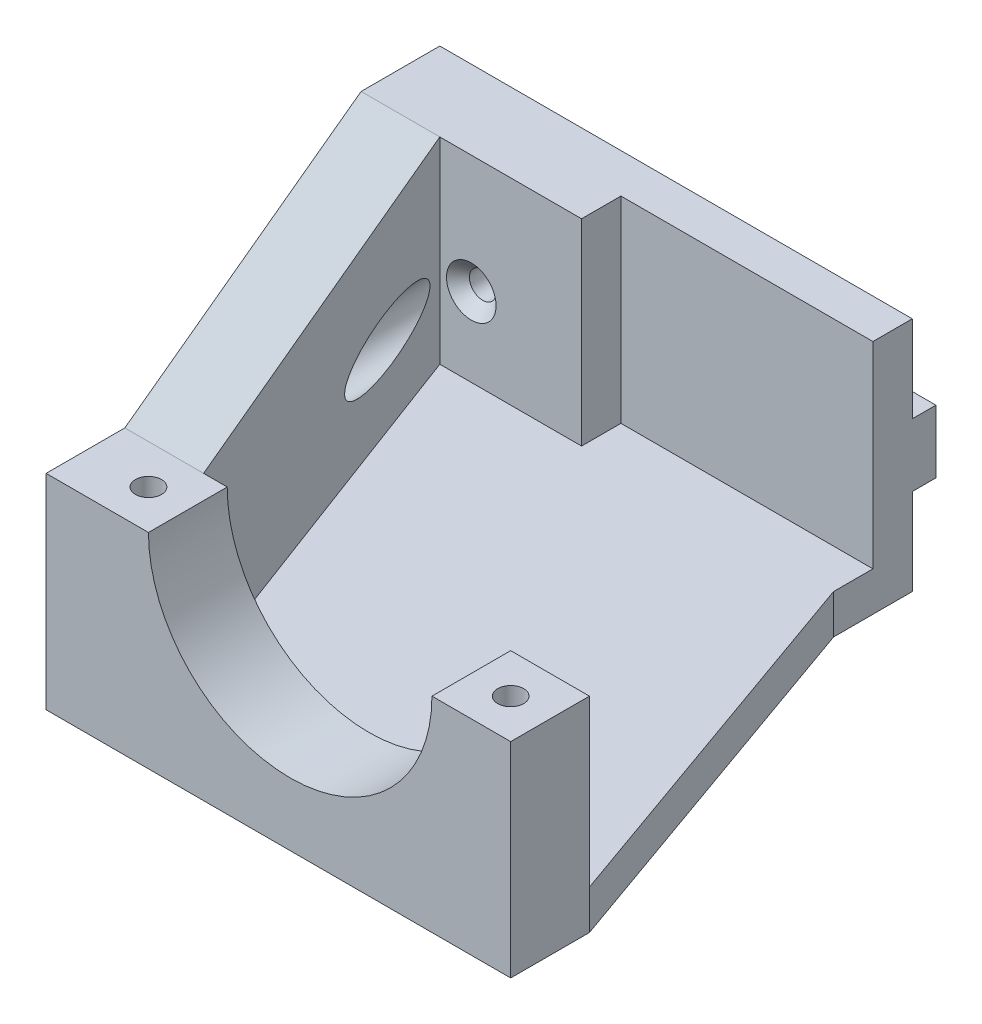
ISO-10303-21;
HEADER;
FILE_DESCRIPTION(('STEP AP214'),'2;1');
FILE_NAME('part.step','',(''),(''),'','','');
FILE_SCHEMA(('AUTOMOTIVE_DESIGN { 1 0 10303 214 1 1 1 1 }'));
ENDSEC;
DATA;
#1=APPLICATION_CONTEXT('core data for automotive mechanical design processes');
#2=APPLICATION_PROTOCOL_DEFINITION('international standard','automotive_design',2000,#1);
#3=PRODUCT_CONTEXT('',#1,'mechanical');
#4=PRODUCT('Part','Part','',(#3));
#5=PRODUCT_RELATED_PRODUCT_CATEGORY('part','',(#4));
#6=PRODUCT_DEFINITION_FORMATION('','',#4);
#7=PRODUCT_DEFINITION_CONTEXT('part definition',#1,'design');
#8=PRODUCT_DEFINITION('design','',#6,#7);
#9=PRODUCT_DEFINITION_SHAPE('','',#8);
#10=(LENGTH_UNIT() NAMED_UNIT(*) SI_UNIT(.MILLI.,.METRE.));
#11=(NAMED_UNIT(*) PLANE_ANGLE_UNIT() SI_UNIT($,.RADIAN.));
#12=(NAMED_UNIT(*) SI_UNIT($,.STERADIAN.) SOLID_ANGLE_UNIT());
#13=UNCERTAINTY_MEASURE_WITH_UNIT(LENGTH_MEASURE(1.E-05),#10,'distance_accuracy_value','');
#14=(GEOMETRIC_REPRESENTATION_CONTEXT(3) GLOBAL_UNCERTAINTY_ASSIGNED_CONTEXT((#13)) GLOBAL_UNIT_ASSIGNED_CONTEXT((#10,
#11,#12)) REPRESENTATION_CONTEXT('',''));
#15=CARTESIAN_POINT('',(0.,0.,0.));
#16=DIRECTION('',(0.,0.,1.));
#17=DIRECTION('',(1.,0.,0.));
#18=AXIS2_PLACEMENT_3D('',#15,#16,#17);
#19=CARTESIAN_POINT('',(18.,26.,68.));
#20=DIRECTION('',(0.,-1.,0.));
#21=DIRECTION('',(0.,0.,-1.));
#22=AXIS2_PLACEMENT_3D('',#19,#20,#21);
#23=PLANE('',#22);
#24=DIRECTION('',(-1.,0.,0.));
#25=VECTOR('',#24,1.);
#26=CARTESIAN_POINT('',(18.,26.,58.));
#27=LINE('',#26,#25);
#28=CARTESIAN_POINT('',(31.,26.,58.));
#29=VERTEX_POINT('',#28);
#30=CARTESIAN_POINT('',(28.,26.,58.));
#31=VERTEX_POINT('',#30);
#32=EDGE_CURVE('E303',#29,#31,#27,.T.);
#33=ORIENTED_EDGE('',*,*,#32,.T.);
#34=DIRECTION('',(1.,0.,0.));
#35=VECTOR('',#34,1.);
#36=CARTESIAN_POINT('',(18.,26.,58.));
#37=LINE('',#36,#35);
#38=CARTESIAN_POINT('',(18.,26.,58.));
#39=VERTEX_POINT('',#38);
#40=EDGE_CURVE('E338',#39,#31,#37,.T.);
#41=ORIENTED_EDGE('',*,*,#40,.F.);
#42=DIRECTION('',(0.,0.,-1.));
#43=VECTOR('',#42,1.);
#44=CARTESIAN_POINT('',(18.,26.,68.));
#45=LINE('',#44,#43);
#46=CARTESIAN_POINT('',(18.,26.,68.));
#47=VERTEX_POINT('',#46);
#48=EDGE_CURVE('E468',#47,#39,#45,.T.);
#49=ORIENTED_EDGE('',*,*,#48,.F.);
#50=DIRECTION('',(-1.,0.,0.));
#51=VECTOR('',#50,1.);
#52=CARTESIAN_POINT('',(18.,26.,68.));
#53=LINE('',#52,#51);
#54=CARTESIAN_POINT('',(31.,26.,68.));
#55=VERTEX_POINT('',#54);
#56=EDGE_CURVE('E309',#55,#47,#53,.T.);
#57=ORIENTED_EDGE('',*,*,#56,.F.);
#58=DIRECTION('',(0.,0.,-1.));
#59=VECTOR('',#58,1.);
#60=CARTESIAN_POINT('',(31.,26.,68.));
#61=LINE('',#60,#59);
#62=EDGE_CURVE('E476',#55,#29,#61,.T.);
#63=ORIENTED_EDGE('',*,*,#62,.T.);
#64=EDGE_LOOP('',(#33,#41,#49,#57,#63));
#65=FACE_BOUND('',#64,.T.);
#66=CARTESIAN_POINT('',(25.9999999999999,26.,63.));
#67=DIRECTION('',(0.,1.,0.));
#68=DIRECTION('',(0.,0.,1.));
#69=AXIS2_PLACEMENT_3D('',#66,#67,#68);
#70=CIRCLE('',#69,1.65);
#71=CARTESIAN_POINT('',(25.9999999999999,26.,64.65));
#72=VERTEX_POINT('',#71);
#73=EDGE_CURVE('E225',#72,#72,#70,.T.);
#74=ORIENTED_EDGE('',*,*,#73,.F.);
#75=EDGE_LOOP('',(#74));
#76=FACE_BOUND('',#75,.T.);
#77=ADVANCED_FACE('F52',(#65,#76),#23,.F.);
#78=CARTESIAN_POINT('',(0.,0.,0.));
#79=DIRECTION('',(0.,0.,-1.));
#80=DIRECTION('',(-1.,0.,0.));
#81=AXIS2_PLACEMENT_3D('',#78,#79,#80);
#82=PLANE('',#81);
#83=CARTESIAN_POINT('',(14.,15.,0.));
#84=DIRECTION('',(0.,0.,-1.));
#85=DIRECTION('',(-1.,0.,0.));
#86=AXIS2_PLACEMENT_3D('',#83,#84,#85);
#87=CIRCLE('',#86,1.7);
#88=CARTESIAN_POINT('',(12.3,15.,0.));
#89=VERTEX_POINT('',#88);
#90=EDGE_CURVE('E56',#89,#89,#87,.T.);
#91=ORIENTED_EDGE('',*,*,#90,.F.);
#92=EDGE_LOOP('',(#91));
#93=FACE_BOUND('',#92,.T.);
#94=DIRECTION('',(0.,-1.,0.));
#95=VECTOR('',#94,1.);
#96=CARTESIAN_POINT('',(5.,19.,0.));
#97=LINE('',#96,#95);
#98=CARTESIAN_POINT('',(5.,19.,0.));
#99=VERTEX_POINT('',#98);
#100=CARTESIAN_POINT('',(5.,11.,0.));
#101=VERTEX_POINT('',#100);
#102=EDGE_CURVE('E249',#99,#101,#97,.T.);
#103=ORIENTED_EDGE('',*,*,#102,.F.);
#104=DIRECTION('',(1.,0.,0.));
#105=VECTOR('',#104,1.);
#106=CARTESIAN_POINT('',(0.,19.,0.));
#107=LINE('',#106,#105);
#108=CARTESIAN_POINT('',(0.,19.,0.));
#109=VERTEX_POINT('',#108);
#110=EDGE_CURVE('E236',#109,#99,#107,.T.);
#111=ORIENTED_EDGE('',*,*,#110,.F.);
#112=DIRECTION('',(0.,-1.,0.));
#113=VECTOR('',#112,1.);
#114=CARTESIAN_POINT('',(0.,0.,0.));
#115=LINE('',#114,#113);
#116=CARTESIAN_POINT('',(0.,30.,0.));
#117=VERTEX_POINT('',#116);
#118=EDGE_CURVE('E591',#117,#109,#115,.T.);
#119=ORIENTED_EDGE('',*,*,#118,.F.);
#120=DIRECTION('',(-1.,0.,0.));
#121=VECTOR('',#120,1.);
#122=CARTESIAN_POINT('',(0.,30.,0.));
#123=LINE('',#122,#121);
#124=CARTESIAN_POINT('',(60.,30.,0.));
#125=VERTEX_POINT('',#124);
#126=EDGE_CURVE('E544',#125,#117,#123,.T.);
#127=ORIENTED_EDGE('',*,*,#126,.F.);
#128=DIRECTION('',(0.,1.,0.));
#129=VECTOR('',#128,1.);
#130=CARTESIAN_POINT('',(60.,0.,0.));
#131=LINE('',#130,#129);
#132=CARTESIAN_POINT('',(60.,19.,0.));
#133=VERTEX_POINT('',#132);
#134=EDGE_CURVE('E597',#133,#125,#131,.T.);
#135=ORIENTED_EDGE('',*,*,#134,.F.);
#136=DIRECTION('',(1.,0.,0.));
#137=VECTOR('',#136,1.);
#138=CARTESIAN_POINT('',(60.,19.,0.));
#139=LINE('',#138,#137);
#140=CARTESIAN_POINT('',(55.,19.,0.));
#141=VERTEX_POINT('',#140);
#142=EDGE_CURVE('E77',#141,#133,#139,.T.);
#143=ORIENTED_EDGE('',*,*,#142,.F.);
#144=DIRECTION('',(0.,1.,0.));
#145=VECTOR('',#144,1.);
#146=CARTESIAN_POINT('',(55.,19.,0.));
#147=LINE('',#146,#145);
#148=CARTESIAN_POINT('',(55.,11.,0.));
#149=VERTEX_POINT('',#148);
#150=EDGE_CURVE('E273',#149,#141,#147,.T.);
#151=ORIENTED_EDGE('',*,*,#150,.F.);
#152=DIRECTION('',(-1.,0.,0.));
#153=VECTOR('',#152,1.);
#154=CARTESIAN_POINT('',(60.,11.,0.));
#155=LINE('',#154,#153);
#156=CARTESIAN_POINT('',(60.,11.,0.));
#157=VERTEX_POINT('',#156);
#158=EDGE_CURVE('E260',#157,#149,#155,.T.);
#159=ORIENTED_EDGE('',*,*,#158,.F.);
#160=CARTESIAN_POINT('',(60.,0.,0.));
#161=VERTEX_POINT('',#160);
#162=EDGE_CURVE('E598',#161,#157,#131,.T.);
#163=ORIENTED_EDGE('',*,*,#162,.F.);
#164=DIRECTION('',(1.,0.,0.));
#165=VECTOR('',#164,1.);
#166=CARTESIAN_POINT('',(0.,0.,0.));
#167=LINE('',#166,#165);
#168=CARTESIAN_POINT('',(0.,0.,0.));
#169=VERTEX_POINT('',#168);
#170=EDGE_CURVE('E594',#169,#161,#167,.T.);
#171=ORIENTED_EDGE('',*,*,#170,.F.);
#172=CARTESIAN_POINT('',(0.,11.,0.));
#173=VERTEX_POINT('',#172);
#174=EDGE_CURVE('E595',#173,#169,#115,.T.);
#175=ORIENTED_EDGE('',*,*,#174,.F.);
#176=DIRECTION('',(-1.,0.,0.));
#177=VECTOR('',#176,1.);
#178=CARTESIAN_POINT('',(0.,11.,0.));
#179=LINE('',#178,#177);
#180=EDGE_CURVE('E241',#101,#173,#179,.T.);
#181=ORIENTED_EDGE('',*,*,#180,.F.);
#182=EDGE_LOOP('',(#103,#111,#119,#127,#135,#143,#151,#159,#163,#171,#175,#181));
#183=FACE_BOUND('',#182,.T.);
#184=ADVANCED_FACE('F431',(#93,#183),#82,.T.);
#185=CARTESIAN_POINT('',(0.,0.,10.));
#186=DIRECTION('',(1.,0.,0.));
#187=DIRECTION('',(0.,0.,-1.));
#188=AXIS2_PLACEMENT_3D('',#185,#186,#187);
#189=PLANE('',#188);
#190=ORIENTED_EDGE('',*,*,#118,.T.);
#191=DIRECTION('',(0.,0.,1.));
#192=VECTOR('',#191,1.);
#193=CARTESIAN_POINT('',(0.,19.,-3.));
#194=LINE('',#193,#192);
#195=CARTESIAN_POINT('',(0.,19.,-3.));
#196=VERTEX_POINT('',#195);
#197=EDGE_CURVE('E258',#196,#109,#194,.T.);
#198=ORIENTED_EDGE('',*,*,#197,.F.);
#199=DIRECTION('',(0.,1.,0.));
#200=VECTOR('',#199,1.);
#201=CARTESIAN_POINT('',(0.,19.,-3.));
#202=LINE('',#201,#200);
#203=CARTESIAN_POINT('',(0.,11.,-3.));
#204=VERTEX_POINT('',#203);
#205=EDGE_CURVE('E237',#204,#196,#202,.T.);
#206=ORIENTED_EDGE('',*,*,#205,.F.);
#207=DIRECTION('',(0.,0.,1.));
#208=VECTOR('',#207,1.);
#209=CARTESIAN_POINT('',(0.,11.,-3.));
#210=LINE('',#209,#208);
#211=EDGE_CURVE('E247',#204,#173,#210,.T.);
#212=ORIENTED_EDGE('',*,*,#211,.T.);
#213=ORIENTED_EDGE('',*,*,#174,.T.);
#214=DIRECTION('',(0.,0.,-1.));
#215=VECTOR('',#214,1.);
#216=CARTESIAN_POINT('',(0.,0.,10.));
#217=LINE('',#216,#215);
#218=CARTESIAN_POINT('',(0.,0.,10.));
#219=VERTEX_POINT('',#218);
#220=EDGE_CURVE('E566',#219,#169,#217,.T.);
#221=ORIENTED_EDGE('',*,*,#220,.F.);
#222=DIRECTION('',(0.,1.,0.));
#223=VECTOR('',#222,1.);
#224=CARTESIAN_POINT('',(0.,0.,10.));
#225=LINE('',#224,#223);
#226=CARTESIAN_POINT('',(0.,30.,10.));
#227=VERTEX_POINT('',#226);
#228=EDGE_CURVE('E539',#227,#219,#225,.F.);
#229=ORIENTED_EDGE('',*,*,#228,.F.);
#230=DIRECTION('',(0.,0.,-1.));
#231=VECTOR('',#230,1.);
#232=CARTESIAN_POINT('',(0.,30.,10.));
#233=LINE('',#232,#231);
#234=EDGE_CURVE('E542',#227,#117,#233,.T.);
#235=ORIENTED_EDGE('',*,*,#234,.T.);
#236=EDGE_LOOP('',(#190,#198,#206,#212,#213,#221,#229,#235));
#237=FACE_BOUND('',#236,.T.);
#238=ADVANCED_FACE('F54',(#237),#189,.F.);
#239=CARTESIAN_POINT('',(0.,0.,10.));
#240=DIRECTION('',(0.,1.,0.));
#241=DIRECTION('',(0.,0.,1.));
#242=AXIS2_PLACEMENT_3D('',#239,#240,#241);
#243=PLANE('',#242);
#244=ORIENTED_EDGE('',*,*,#170,.T.);
#245=DIRECTION('',(0.,0.,-1.));
#246=VECTOR('',#245,1.);
#247=CARTESIAN_POINT('',(60.,0.,10.));
#248=LINE('',#247,#246);
#249=CARTESIAN_POINT('',(60.,0.,10.));
#250=VERTEX_POINT('',#249);
#251=EDGE_CURVE('E564',#250,#161,#248,.T.);
#252=ORIENTED_EDGE('',*,*,#251,.F.);
#253=DIRECTION('',(0.333847142244594,0.,0.942627225161208));
#254=VECTOR('',#253,1.);
#255=CARTESIAN_POINT('',(60.,0.,10.));
#256=LINE('',#255,#254);
#257=CARTESIAN_POINT('',(77.,0.,58.));
#258=VERTEX_POINT('',#257);
#259=EDGE_CURVE('E344',#250,#258,#256,.T.);
#260=ORIENTED_EDGE('',*,*,#259,.T.);
#261=DIRECTION('',(0.,0.,-1.));
#262=VECTOR('',#261,1.);
#263=CARTESIAN_POINT('',(77.,0.,68.));
#264=LINE('',#263,#262);
#265=CARTESIAN_POINT('',(77.,0.,68.));
#266=VERTEX_POINT('',#265);
#267=EDGE_CURVE('E497',#266,#258,#264,.T.);
#268=ORIENTED_EDGE('',*,*,#267,.F.);
#269=DIRECTION('',(1.,0.,0.));
#270=VECTOR('',#269,1.);
#271=CARTESIAN_POINT('',(18.,0.,68.));
#272=LINE('',#271,#270);
#273=CARTESIAN_POINT('',(18.,0.,68.));
#274=VERTEX_POINT('',#273);
#275=EDGE_CURVE('E299',#274,#266,#272,.T.);
#276=ORIENTED_EDGE('',*,*,#275,.F.);
#277=DIRECTION('',(0.,0.,-1.));
#278=VECTOR('',#277,1.);
#279=CARTESIAN_POINT('',(18.,0.,68.));
#280=LINE('',#279,#278);
#281=CARTESIAN_POINT('',(18.,0.,58.));
#282=VERTEX_POINT('',#281);
#283=EDGE_CURVE('E313',#274,#282,#280,.T.);
#284=ORIENTED_EDGE('',*,*,#283,.T.);
#285=DIRECTION('',(0.351123441588392,0.,0.936329177569045));
#286=VECTOR('',#285,1.);
#287=CARTESIAN_POINT('',(0.,0.,10.));
#288=LINE('',#287,#286);
#289=EDGE_CURVE('E341',#219,#282,#288,.T.);
#290=ORIENTED_EDGE('',*,*,#289,.F.);
#291=ORIENTED_EDGE('',*,*,#220,.T.);
#292=EDGE_LOOP('',(#244,#252,#260,#268,#276,#284,#290,#291));
#293=FACE_BOUND('',#292,.T.);
#294=ADVANCED_FACE('F440',(#293),#243,.F.);
#295=CARTESIAN_POINT('',(60.,0.,10.));
#296=DIRECTION('',(-1.,0.,0.));
#297=DIRECTION('',(0.,0.,1.));
#298=AXIS2_PLACEMENT_3D('',#295,#296,#297);
#299=PLANE('',#298);
#300=DIRECTION('',(0.,-1.,0.));
#301=VECTOR('',#300,1.);
#302=CARTESIAN_POINT('',(60.,0.,5.));
#303=LINE('',#302,#301);
#304=CARTESIAN_POINT('',(60.,30.,5.));
#305=VERTEX_POINT('',#304);
#306=CARTESIAN_POINT('',(60.,5.,5.));
#307=VERTEX_POINT('',#306);
#308=EDGE_CURVE('E589',#305,#307,#303,.T.);
#309=ORIENTED_EDGE('',*,*,#308,.T.);
#310=DIRECTION('',(0.,0.,1.));
#311=VECTOR('',#310,1.);
#312=CARTESIAN_POINT('',(60.,5.,10.));
#313=LINE('',#312,#311);
#314=CARTESIAN_POINT('',(60.,5.,10.));
#315=VERTEX_POINT('',#314);
#316=EDGE_CURVE('E559',#307,#315,#313,.T.);
#317=ORIENTED_EDGE('',*,*,#316,.T.);
#318=DIRECTION('',(0.,1.,0.));
#319=VECTOR('',#318,1.);
#320=CARTESIAN_POINT('',(60.,0.,10.));
#321=LINE('',#320,#319);
#322=EDGE_CURVE('E535',#250,#315,#321,.T.);
#323=ORIENTED_EDGE('',*,*,#322,.F.);
#324=ORIENTED_EDGE('',*,*,#251,.T.);
#325=ORIENTED_EDGE('',*,*,#162,.T.);
#326=DIRECTION('',(0.,0.,1.));
#327=VECTOR('',#326,1.);
#328=CARTESIAN_POINT('',(60.,11.,-3.));
#329=LINE('',#328,#327);
#330=CARTESIAN_POINT('',(60.,11.,-3.));
#331=VERTEX_POINT('',#330);
#332=EDGE_CURVE('E284',#331,#157,#329,.T.);
#333=ORIENTED_EDGE('',*,*,#332,.F.);
#334=DIRECTION('',(0.,-1.,0.));
#335=VECTOR('',#334,1.);
#336=CARTESIAN_POINT('',(60.,19.,-3.));
#337=LINE('',#336,#335);
#338=CARTESIAN_POINT('',(60.,19.,-3.));
#339=VERTEX_POINT('',#338);
#340=EDGE_CURVE('E261',#339,#331,#337,.T.);
#341=ORIENTED_EDGE('',*,*,#340,.F.);
#342=DIRECTION('',(0.,0.,1.));
#343=VECTOR('',#342,1.);
#344=CARTESIAN_POINT('',(60.,19.,-3.));
#345=LINE('',#344,#343);
#346=EDGE_CURVE('E270',#339,#133,#345,.T.);
#347=ORIENTED_EDGE('',*,*,#346,.T.);
#348=ORIENTED_EDGE('',*,*,#134,.T.);
#349=DIRECTION('',(0.,0.,-1.));
#350=VECTOR('',#349,1.);
#351=CARTESIAN_POINT('',(60.,30.,10.));
#352=LINE('',#351,#350);
#353=EDGE_CURVE('E567',#305,#125,#352,.T.);
#354=ORIENTED_EDGE('',*,*,#353,.F.);
#355=EDGE_LOOP('',(#309,#317,#323,#324,#325,#333,#341,#347,#348,#354));
#356=FACE_BOUND('',#355,.T.);
#357=ADVANCED_FACE('F437',(#356),#299,.F.);
#358=CARTESIAN_POINT('',(0.,30.,10.));
#359=DIRECTION('',(0.,-1.,0.));
#360=DIRECTION('',(0.,0.,-1.));
#361=AXIS2_PLACEMENT_3D('',#358,#359,#360);
#362=PLANE('',#361);
#363=DIRECTION('',(-1.,0.,0.));
#364=VECTOR('',#363,1.);
#365=CARTESIAN_POINT('',(0.,30.,10.));
#366=LINE('',#365,#364);
#367=CARTESIAN_POINT('',(28.,30.,10.));
#368=VERTEX_POINT('',#367);
#369=CARTESIAN_POINT('',(10.,30.,10.));
#370=VERTEX_POINT('',#369);
#371=EDGE_CURVE('E538',#368,#370,#366,.T.);
#372=ORIENTED_EDGE('',*,*,#371,.F.);
#373=DIRECTION('',(0.,0.,-1.));
#374=VECTOR('',#373,1.);
#375=CARTESIAN_POINT('',(28.,30.,10.));
#376=LINE('',#375,#374);
#377=CARTESIAN_POINT('',(28.,30.,5.));
#378=VERTEX_POINT('',#377);
#379=EDGE_CURVE('E562',#368,#378,#376,.T.);
#380=ORIENTED_EDGE('',*,*,#379,.T.);
#381=DIRECTION('',(1.,0.,0.));
#382=VECTOR('',#381,1.);
#383=CARTESIAN_POINT('',(0.,30.,5.));
#384=LINE('',#383,#382);
#385=EDGE_CURVE('E61',#378,#305,#384,.T.);
#386=ORIENTED_EDGE('',*,*,#385,.T.);
#387=ORIENTED_EDGE('',*,*,#353,.T.);
#388=ORIENTED_EDGE('',*,*,#126,.T.);
#389=ORIENTED_EDGE('',*,*,#234,.F.);
#390=DIRECTION('',(-1.,0.,0.));
#391=VECTOR('',#390,1.);
#392=CARTESIAN_POINT('',(0.,30.,10.));
#393=LINE('',#392,#391);
#394=EDGE_CURVE('E499',#370,#227,#393,.T.);
#395=ORIENTED_EDGE('',*,*,#394,.F.);
#396=EDGE_LOOP('',(#372,#380,#386,#387,#388,#389,#395));
#397=FACE_BOUND('',#396,.T.);
#398=ADVANCED_FACE('F429',(#397),#362,.F.);
#399=CARTESIAN_POINT('',(0.,0.,10.));
#400=DIRECTION('',(0.,0.,-1.));
#401=DIRECTION('',(-1.,0.,0.));
#402=AXIS2_PLACEMENT_3D('',#399,#400,#401);
#403=PLANE('',#402);
#404=CARTESIAN_POINT('',(14.,15.,10.));
#405=DIRECTION('',(0.,0.,1.));
#406=DIRECTION('',(1.,0.,0.));
#407=AXIS2_PLACEMENT_3D('',#404,#405,#406);
#408=CIRCLE('',#407,3.15);
#409=CARTESIAN_POINT('',(17.15,15.,10.));
#410=VERTEX_POINT('',#409);
#411=EDGE_CURVE('E296',#410,#410,#408,.T.);
#412=ORIENTED_EDGE('',*,*,#411,.F.);
#413=EDGE_LOOP('',(#412));
#414=FACE_BOUND('',#413,.T.);
#415=DIRECTION('',(0.,1.,0.));
#416=VECTOR('',#415,1.);
#417=CARTESIAN_POINT('',(10.,30.,10.));
#418=LINE('',#417,#416);
#419=CARTESIAN_POINT('',(10.,5.,10.));
#420=VERTEX_POINT('',#419);
#421=EDGE_CURVE('E349',#420,#370,#418,.T.);
#422=ORIENTED_EDGE('',*,*,#421,.F.);
#423=DIRECTION('',(-1.,0.,0.));
#424=VECTOR('',#423,1.);
#425=CARTESIAN_POINT('',(0.,5.,10.));
#426=LINE('',#425,#424);
#427=CARTESIAN_POINT('',(28.,5.,10.));
#428=VERTEX_POINT('',#427);
#429=EDGE_CURVE('E12',#420,#428,#426,.F.);
#430=ORIENTED_EDGE('',*,*,#429,.T.);
#431=DIRECTION('',(0.,1.,0.));
#432=VECTOR('',#431,1.);
#433=CARTESIAN_POINT('',(28.,0.,10.));
#434=LINE('',#433,#432);
#435=EDGE_CURVE('E570',#428,#368,#434,.T.);
#436=ORIENTED_EDGE('',*,*,#435,.T.);
#437=ORIENTED_EDGE('',*,*,#371,.T.);
#438=EDGE_LOOP('',(#422,#430,#436,#437));
#439=FACE_BOUND('',#438,.T.);
#440=ADVANCED_FACE('F419',(#414,#439),#403,.F.);
#441=CARTESIAN_POINT('',(0.,0.,5.));
#442=DIRECTION('',(0.,0.,-1.));
#443=DIRECTION('',(-1.,0.,0.));
#444=AXIS2_PLACEMENT_3D('',#441,#442,#443);
#445=PLANE('',#444);
#446=ORIENTED_EDGE('',*,*,#385,.F.);
#447=DIRECTION('',(0.,-1.,0.));
#448=VECTOR('',#447,1.);
#449=CARTESIAN_POINT('',(28.,5.,5.));
#450=LINE('',#449,#448);
#451=CARTESIAN_POINT('',(28.,5.,5.));
#452=VERTEX_POINT('',#451);
#453=EDGE_CURVE('E495',#378,#452,#450,.T.);
#454=ORIENTED_EDGE('',*,*,#453,.T.);
#455=DIRECTION('',(1.,0.,0.));
#456=VECTOR('',#455,1.);
#457=CARTESIAN_POINT('',(28.,5.,5.));
#458=LINE('',#457,#456);
#459=EDGE_CURVE('E582',#452,#307,#458,.T.);
#460=ORIENTED_EDGE('',*,*,#459,.T.);
#461=ORIENTED_EDGE('',*,*,#308,.F.);
#462=EDGE_LOOP('',(#446,#454,#460,#461));
#463=FACE_BOUND('',#462,.T.);
#464=ADVANCED_FACE('F415',(#463),#445,.F.);
#465=CARTESIAN_POINT('',(28.,5.,5.));
#466=DIRECTION('',(-1.,0.,0.));
#467=DIRECTION('',(0.,0.,1.));
#468=AXIS2_PLACEMENT_3D('',#465,#466,#467);
#469=PLANE('',#468);
#470=ORIENTED_EDGE('',*,*,#435,.F.);
#471=DIRECTION('',(0.,0.,1.));
#472=VECTOR('',#471,1.);
#473=CARTESIAN_POINT('',(28.,5.,5.));
#474=LINE('',#473,#472);
#475=EDGE_CURVE('E563',#452,#428,#474,.T.);
#476=ORIENTED_EDGE('',*,*,#475,.F.);
#477=ORIENTED_EDGE('',*,*,#453,.F.);
#478=ORIENTED_EDGE('',*,*,#379,.F.);
#479=EDGE_LOOP('',(#470,#476,#477,#478));
#480=FACE_BOUND('',#479,.T.);
#481=ADVANCED_FACE('F418',(#480),#469,.F.);
#482=CARTESIAN_POINT('',(28.,5.,5.));
#483=DIRECTION('',(0.,-1.,0.));
#484=DIRECTION('',(0.,0.,-1.));
#485=AXIS2_PLACEMENT_3D('',#482,#483,#484);
#486=PLANE('',#485);
#487=ORIENTED_EDGE('',*,*,#459,.F.);
#488=ORIENTED_EDGE('',*,*,#475,.T.);
#489=ORIENTED_EDGE('',*,*,#429,.F.);
#490=DIRECTION('',(0.351123441588392,0.,0.936329177569045));
#491=VECTOR('',#490,1.);
#492=CARTESIAN_POINT('',(10.,5.,10.));
#493=LINE('',#492,#491);
#494=CARTESIAN_POINT('',(28.,5.,58.));
#495=VERTEX_POINT('',#494);
#496=EDGE_CURVE('E324',#420,#495,#493,.T.);
#497=ORIENTED_EDGE('',*,*,#496,.T.);
#498=DIRECTION('',(1.,0.,0.));
#499=VECTOR('',#498,1.);
#500=CARTESIAN_POINT('',(28.,5.,58.));
#501=LINE('',#500,#499);
#502=CARTESIAN_POINT('',(77.,5.,58.));
#503=VERTEX_POINT('',#502);
#504=EDGE_CURVE('E518',#495,#503,#501,.T.);
#505=ORIENTED_EDGE('',*,*,#504,.T.);
#506=DIRECTION('',(0.333847142244594,0.,0.942627225161207));
#507=VECTOR('',#506,1.);
#508=CARTESIAN_POINT('',(60.,5.,10.));
#509=LINE('',#508,#507);
#510=EDGE_CURVE('E328',#315,#503,#509,.T.);
#511=ORIENTED_EDGE('',*,*,#510,.F.);
#512=ORIENTED_EDGE('',*,*,#316,.F.);
#513=EDGE_LOOP('',(#487,#488,#489,#497,#505,#511,#512));
#514=FACE_BOUND('',#513,.T.);
#515=ADVANCED_FACE('F378',(#514),#486,.F.);
#516=CARTESIAN_POINT('',(-3.28767123287671,0.,1.23287671232877));
#517=DIRECTION('',(-0.936329177569045,0.,0.351123441588392));
#518=DIRECTION('',(0.351123441588392,0.,0.936329177569045));
#519=AXIS2_PLACEMENT_3D('',#516,#517,#518);
#520=PLANE('',#519);
#521=CARTESIAN_POINT('',(14.,15.,47.3333333333333));
#522=DIRECTION('',(-0.936329177569045,0.,0.351123441588392));
#523=DIRECTION('',(-0.351123441588392,0.,-0.936329177569045));
#524=AXIS2_PLACEMENT_3D('',#521,#522,#523);
#525=ELLIPSE('',#524,9.25600405742733,3.25);
#526=CARTESIAN_POINT('',(10.75,15.,38.6666666666667));
#527=VERTEX_POINT('',#526);
#528=EDGE_CURVE('E290',#527,#527,#525,.T.);
#529=ORIENTED_EDGE('',*,*,#528,.F.);
#530=EDGE_LOOP('',(#529));
#531=FACE_BOUND('',#530,.T.);
#532=ORIENTED_EDGE('',*,*,#289,.T.);
#533=DIRECTION('',(0.,1.,0.));
#534=VECTOR('',#533,1.);
#535=CARTESIAN_POINT('',(18.,26.,58.));
#536=LINE('',#535,#534);
#537=EDGE_CURVE('E360',#282,#39,#536,.T.);
#538=ORIENTED_EDGE('',*,*,#537,.T.);
#539=DIRECTION('',(0.350059428712986,-0.0777909841584414,0.933491809901297));
#540=VECTOR('',#539,1.);
#541=CARTESIAN_POINT('',(0.,30.,10.));
#542=LINE('',#541,#540);
#543=EDGE_CURVE('E333',#227,#39,#542,.T.);
#544=ORIENTED_EDGE('',*,*,#543,.F.);
#545=ORIENTED_EDGE('',*,*,#228,.T.);
#546=EDGE_LOOP('',(#532,#538,#544,#545));
#547=FACE_BOUND('',#546,.T.);
#548=ADVANCED_FACE('F367',(#531,#547),#520,.T.);
#549=CARTESIAN_POINT('',(50.1658310836868,0.,-17.7670651754724));
#550=DIRECTION('',(0.942627225161208,0.,-0.333847142244594));
#551=DIRECTION('',(-0.333847142244594,0.,-0.942627225161207));
#552=AXIS2_PLACEMENT_3D('',#549,#550,#551);
#553=PLANE('',#552);
#554=ORIENTED_EDGE('',*,*,#510,.T.);
#555=DIRECTION('',(0.,-1.,0.));
#556=VECTOR('',#555,1.);
#557=CARTESIAN_POINT('',(77.,5.,58.));
#558=LINE('',#557,#556);
#559=EDGE_CURVE('E496',#503,#258,#558,.T.);
#560=ORIENTED_EDGE('',*,*,#559,.T.);
#561=ORIENTED_EDGE('',*,*,#259,.F.);
#562=ORIENTED_EDGE('',*,*,#322,.T.);
#563=EDGE_LOOP('',(#554,#560,#561,#562));
#564=FACE_BOUND('',#563,.T.);
#565=ADVANCED_FACE('F377',(#564),#553,.T.);
#566=CARTESIAN_POINT('',(5.47945205479453,0.,-2.05479452054795));
#567=DIRECTION('',(0.936329177569045,0.,-0.351123441588392));
#568=DIRECTION('',(-0.351123441588391,0.,-0.936329177569045));
#569=AXIS2_PLACEMENT_3D('',#566,#567,#568);
#570=PLANE('',#569);
#571=CARTESIAN_POINT('',(14.,15.,20.6666666666666));
#572=DIRECTION('',(0.936329177569045,0.,-0.351123441588392));
#573=DIRECTION('',(-0.351123441588391,0.,-0.936329177569045));
#574=AXIS2_PLACEMENT_3D('',#571,#572,#573);
#575=ELLIPSE('',#574,9.25600405742733,3.25);
#576=CARTESIAN_POINT('',(10.75,15.,12.));
#577=VERTEX_POINT('',#576);
#578=EDGE_CURVE('E287',#577,#577,#575,.T.);
#579=ORIENTED_EDGE('',*,*,#578,.F.);
#580=EDGE_LOOP('',(#579));
#581=FACE_BOUND('',#580,.T.);
#582=DIRECTION('',(0.350059428712986,-0.0777909841584411,0.933491809901297));
#583=VECTOR('',#582,1.);
#584=CARTESIAN_POINT('',(10.,30.,10.));
#585=LINE('',#584,#583);
#586=EDGE_CURVE('E327',#370,#31,#585,.T.);
#587=ORIENTED_EDGE('',*,*,#586,.T.);
#588=DIRECTION('',(0.,-1.,0.));
#589=VECTOR('',#588,1.);
#590=CARTESIAN_POINT('',(28.,26.,58.));
#591=LINE('',#590,#589);
#592=EDGE_CURVE('E510',#31,#495,#591,.T.);
#593=ORIENTED_EDGE('',*,*,#592,.T.);
#594=ORIENTED_EDGE('',*,*,#496,.F.);
#595=ORIENTED_EDGE('',*,*,#421,.T.);
#596=EDGE_LOOP('',(#587,#593,#594,#595));
#597=FACE_BOUND('',#596,.T.);
#598=ADVANCED_FACE('F386',(#581,#597),#570,.T.);
#599=CARTESIAN_POINT('',(0.,30.6206896551724,2.55172413793104));
#600=DIRECTION('',(0.,0.99654575824488,0.0830454798537401));
#601=DIRECTION('',(0.,-0.0830454798537401,0.99654575824488));
#602=AXIS2_PLACEMENT_3D('',#599,#600,#601);
#603=PLANE('',#602);
#604=ORIENTED_EDGE('',*,*,#543,.T.);
#605=ORIENTED_EDGE('',*,*,#40,.T.);
#606=ORIENTED_EDGE('',*,*,#586,.F.);
#607=ORIENTED_EDGE('',*,*,#394,.T.);
#608=EDGE_LOOP('',(#604,#605,#606,#607));
#609=FACE_BOUND('',#608,.T.);
#610=ADVANCED_FACE('F405',(#609),#603,.T.);
#611=CARTESIAN_POINT('',(49.,26.,58.));
#612=DIRECTION('',(0.,0.,1.));
#613=DIRECTION('',(1.,0.,0.));
#614=AXIS2_PLACEMENT_3D('',#611,#612,#613);
#615=PLANE('',#614);
#616=DIRECTION('',(0.,1.,0.));
#617=VECTOR('',#616,1.);
#618=CARTESIAN_POINT('',(77.,0.,58.));
#619=LINE('',#618,#617);
#620=CARTESIAN_POINT('',(77.,26.,58.));
#621=VERTEX_POINT('',#620);
#622=EDGE_CURVE('E319',#503,#621,#619,.T.);
#623=ORIENTED_EDGE('',*,*,#622,.F.);
#624=ORIENTED_EDGE('',*,*,#504,.F.);
#625=ORIENTED_EDGE('',*,*,#592,.F.);
#626=ORIENTED_EDGE('',*,*,#32,.F.);
#627=CARTESIAN_POINT('',(49.,26.,58.));
#628=DIRECTION('',(0.,0.,-1.));
#629=DIRECTION('',(1.,0.,0.));
#630=AXIS2_PLACEMENT_3D('',#627,#628,#629);
#631=CIRCLE('',#630,18.);
#632=CARTESIAN_POINT('',(67.,26.,58.));
#633=VERTEX_POINT('',#632);
#634=EDGE_CURVE('E639',#633,#29,#631,.T.);
#635=ORIENTED_EDGE('',*,*,#634,.F.);
#636=DIRECTION('',(-1.,0.,0.));
#637=VECTOR('',#636,1.);
#638=CARTESIAN_POINT('',(77.,26.,58.));
#639=LINE('',#638,#637);
#640=EDGE_CURVE('E316',#621,#633,#639,.T.);
#641=ORIENTED_EDGE('',*,*,#640,.F.);
#642=EDGE_LOOP('',(#623,#624,#625,#626,#635,#641));
#643=FACE_BOUND('',#642,.T.);
#644=ADVANCED_FACE('F414',(#643),#615,.F.);
#645=CARTESIAN_POINT('',(77.,0.,68.));
#646=DIRECTION('',(-1.,0.,0.));
#647=DIRECTION('',(0.,0.,1.));
#648=AXIS2_PLACEMENT_3D('',#645,#646,#647);
#649=PLANE('',#648);
#650=ORIENTED_EDGE('',*,*,#559,.F.);
#651=ORIENTED_EDGE('',*,*,#622,.T.);
#652=DIRECTION('',(0.,0.,-1.));
#653=VECTOR('',#652,1.);
#654=CARTESIAN_POINT('',(77.,26.,68.));
#655=LINE('',#654,#653);
#656=CARTESIAN_POINT('',(77.,26.,68.));
#657=VERTEX_POINT('',#656);
#658=EDGE_CURVE('E500',#657,#621,#655,.T.);
#659=ORIENTED_EDGE('',*,*,#658,.F.);
#660=DIRECTION('',(0.,1.,0.));
#661=VECTOR('',#660,1.);
#662=CARTESIAN_POINT('',(77.,0.,68.));
#663=LINE('',#662,#661);
#664=EDGE_CURVE('E302',#266,#657,#663,.T.);
#665=ORIENTED_EDGE('',*,*,#664,.F.);
#666=ORIENTED_EDGE('',*,*,#267,.T.);
#667=EDGE_LOOP('',(#650,#651,#659,#665,#666));
#668=FACE_BOUND('',#667,.T.);
#669=ADVANCED_FACE('F380',(#668),#649,.F.);
#670=CARTESIAN_POINT('',(77.,26.,68.));
#671=DIRECTION('',(0.,-1.,0.));
#672=DIRECTION('',(0.,0.,-1.));
#673=AXIS2_PLACEMENT_3D('',#670,#671,#672);
#674=PLANE('',#673);
#675=CARTESIAN_POINT('',(72.,26.,63.));
#676=DIRECTION('',(0.,1.,0.));
#677=DIRECTION('',(0.,0.,1.));
#678=AXIS2_PLACEMENT_3D('',#675,#676,#677);
#679=CIRCLE('',#678,1.65);
#680=CARTESIAN_POINT('',(72.,26.,64.65));
#681=VERTEX_POINT('',#680);
#682=EDGE_CURVE('E233',#681,#681,#679,.T.);
#683=ORIENTED_EDGE('',*,*,#682,.F.);
#684=EDGE_LOOP('',(#683));
#685=FACE_BOUND('',#684,.T.);
#686=ORIENTED_EDGE('',*,*,#640,.T.);
#687=DIRECTION('',(0.,0.,-1.));
#688=VECTOR('',#687,1.);
#689=CARTESIAN_POINT('',(67.,26.,68.));
#690=LINE('',#689,#688);
#691=CARTESIAN_POINT('',(67.,26.,68.));
#692=VERTEX_POINT('',#691);
#693=EDGE_CURVE('E645',#692,#633,#690,.T.);
#694=ORIENTED_EDGE('',*,*,#693,.F.);
#695=DIRECTION('',(-1.,0.,0.));
#696=VECTOR('',#695,1.);
#697=CARTESIAN_POINT('',(77.,26.,68.));
#698=LINE('',#697,#696);
#699=EDGE_CURVE('E305',#657,#692,#698,.T.);
#700=ORIENTED_EDGE('',*,*,#699,.F.);
#701=ORIENTED_EDGE('',*,*,#658,.T.);
#702=EDGE_LOOP('',(#686,#694,#700,#701));
#703=FACE_BOUND('',#702,.T.);
#704=ADVANCED_FACE('F651',(#685,#703),#674,.F.);
#705=CARTESIAN_POINT('',(49.,26.,68.));
#706=DIRECTION('',(0.,0.,-1.));
#707=DIRECTION('',(-1.,0.,0.));
#708=AXIS2_PLACEMENT_3D('',#705,#706,#707);
#709=CYLINDRICAL_SURFACE('',#708,18.);
#710=ORIENTED_EDGE('',*,*,#634,.T.);
#711=ORIENTED_EDGE('',*,*,#62,.F.);
#712=CARTESIAN_POINT('',(49.,26.,68.));
#713=DIRECTION('',(0.,0.,-1.));
#714=DIRECTION('',(1.,0.,0.));
#715=AXIS2_PLACEMENT_3D('',#712,#713,#714);
#716=CIRCLE('',#715,18.);
#717=EDGE_CURVE('E307',#692,#55,#716,.T.);
#718=ORIENTED_EDGE('',*,*,#717,.F.);
#719=ORIENTED_EDGE('',*,*,#693,.T.);
#720=EDGE_LOOP('',(#710,#711,#718,#719));
#721=FACE_BOUND('',#720,.T.);
#722=ADVANCED_FACE('F461',(#721),#709,.F.);
#723=CARTESIAN_POINT('',(18.,0.,68.));
#724=DIRECTION('',(1.,0.,0.));
#725=DIRECTION('',(0.,0.,-1.));
#726=AXIS2_PLACEMENT_3D('',#723,#724,#725);
#727=PLANE('',#726);
#728=ORIENTED_EDGE('',*,*,#537,.F.);
#729=ORIENTED_EDGE('',*,*,#283,.F.);
#730=DIRECTION('',(0.,-1.,0.));
#731=VECTOR('',#730,1.);
#732=CARTESIAN_POINT('',(18.,0.,68.));
#733=LINE('',#732,#731);
#734=EDGE_CURVE('E311',#47,#274,#733,.T.);
#735=ORIENTED_EDGE('',*,*,#734,.F.);
#736=ORIENTED_EDGE('',*,*,#48,.T.);
#737=EDGE_LOOP('',(#728,#729,#735,#736));
#738=FACE_BOUND('',#737,.T.);
#739=ADVANCED_FACE('F458',(#738),#727,.F.);
#740=CARTESIAN_POINT('',(49.,26.,68.));
#741=DIRECTION('',(0.,0.,1.));
#742=DIRECTION('',(1.,0.,0.));
#743=AXIS2_PLACEMENT_3D('',#740,#741,#742);
#744=PLANE('',#743);
#745=ORIENTED_EDGE('',*,*,#275,.T.);
#746=ORIENTED_EDGE('',*,*,#664,.T.);
#747=ORIENTED_EDGE('',*,*,#699,.T.);
#748=ORIENTED_EDGE('',*,*,#717,.T.);
#749=ORIENTED_EDGE('',*,*,#56,.T.);
#750=ORIENTED_EDGE('',*,*,#734,.T.);
#751=EDGE_LOOP('',(#745,#746,#747,#748,#749,#750));
#752=FACE_BOUND('',#751,.T.);
#753=ADVANCED_FACE('F632',(#752),#744,.T.);
#754=CARTESIAN_POINT('',(14.,15.,10.));
#755=DIRECTION('',(0.,0.,1.));
#756=DIRECTION('',(1.,0.,0.));
#757=AXIS2_PLACEMENT_3D('',#754,#755,#756);
#758=CONICAL_SURFACE('',#757,3.15,0.785398163397448);
#759=CARTESIAN_POINT('',(14.,15.,8.55));
#760=DIRECTION('',(0.,0.,1.));
#761=DIRECTION('',(1.,0.,0.));
#762=AXIS2_PLACEMENT_3D('',#759,#760,#761);
#763=CIRCLE('',#762,1.7);
#764=CARTESIAN_POINT('',(15.7,15.,8.55));
#765=VERTEX_POINT('',#764);
#766=EDGE_CURVE('E293',#765,#765,#763,.T.);
#767=ORIENTED_EDGE('',*,*,#766,.F.);
#768=EDGE_LOOP('',(#767));
#769=FACE_BOUND('',#768,.T.);
#770=ORIENTED_EDGE('',*,*,#411,.T.);
#771=EDGE_LOOP('',(#770));
#772=FACE_BOUND('',#771,.T.);
#773=ADVANCED_FACE('F664',(#769,#772),#758,.F.);
#774=CARTESIAN_POINT('',(14.,15.,10.));
#775=DIRECTION('',(0.,0.,1.));
#776=DIRECTION('',(1.,0.,0.));
#777=AXIS2_PLACEMENT_3D('',#774,#775,#776);
#778=CYLINDRICAL_SURFACE('',#777,1.7);
#779=ORIENTED_EDGE('',*,*,#90,.T.);
#780=EDGE_LOOP('',(#779));
#781=FACE_BOUND('',#780,.T.);
#782=ORIENTED_EDGE('',*,*,#766,.T.);
#783=EDGE_LOOP('',(#782));
#784=FACE_BOUND('',#783,.T.);
#785=ADVANCED_FACE('F667',(#781,#784),#778,.F.);
#786=CARTESIAN_POINT('',(14.,15.,68.001025));
#787=DIRECTION('',(0.,0.,-1.));
#788=DIRECTION('',(-1.,0.,0.));
#789=AXIS2_PLACEMENT_3D('',#786,#787,#788);
#790=CYLINDRICAL_SURFACE('',#789,3.25);
#791=ORIENTED_EDGE('',*,*,#528,.T.);
#792=EDGE_LOOP('',(#791));
#793=FACE_BOUND('',#792,.T.);
#794=ORIENTED_EDGE('',*,*,#578,.T.);
#795=EDGE_LOOP('',(#794));
#796=FACE_BOUND('',#795,.T.);
#797=ADVANCED_FACE('F671',(#793,#796),#790,.F.);
#798=CARTESIAN_POINT('',(60.,11.,-3.));
#799=DIRECTION('',(0.,1.,0.));
#800=DIRECTION('',(0.,0.,1.));
#801=AXIS2_PLACEMENT_3D('',#798,#799,#800);
#802=PLANE('',#801);
#803=ORIENTED_EDGE('',*,*,#158,.T.);
#804=DIRECTION('',(0.,0.,1.));
#805=VECTOR('',#804,1.);
#806=CARTESIAN_POINT('',(55.,11.,-3.));
#807=LINE('',#806,#805);
#808=CARTESIAN_POINT('',(55.,11.,-3.));
#809=VERTEX_POINT('',#808);
#810=EDGE_CURVE('E281',#809,#149,#807,.T.);
#811=ORIENTED_EDGE('',*,*,#810,.F.);
#812=DIRECTION('',(-1.,0.,0.));
#813=VECTOR('',#812,1.);
#814=CARTESIAN_POINT('',(60.,11.,-3.));
#815=LINE('',#814,#813);
#816=EDGE_CURVE('E264',#331,#809,#815,.T.);
#817=ORIENTED_EDGE('',*,*,#816,.F.);
#818=ORIENTED_EDGE('',*,*,#332,.T.);
#819=EDGE_LOOP('',(#803,#811,#817,#818));
#820=FACE_BOUND('',#819,.T.);
#821=ADVANCED_FACE('F675',(#820),#802,.F.);
#822=CARTESIAN_POINT('',(55.,19.,-3.));
#823=DIRECTION('',(1.,0.,0.));
#824=DIRECTION('',(0.,0.,-1.));
#825=AXIS2_PLACEMENT_3D('',#822,#823,#824);
#826=PLANE('',#825);
#827=ORIENTED_EDGE('',*,*,#150,.T.);
#828=DIRECTION('',(0.,0.,1.));
#829=VECTOR('',#828,1.);
#830=CARTESIAN_POINT('',(55.,19.,-3.));
#831=LINE('',#830,#829);
#832=CARTESIAN_POINT('',(55.,19.,-3.));
#833=VERTEX_POINT('',#832);
#834=EDGE_CURVE('E278',#833,#141,#831,.T.);
#835=ORIENTED_EDGE('',*,*,#834,.F.);
#836=DIRECTION('',(0.,1.,0.));
#837=VECTOR('',#836,1.);
#838=CARTESIAN_POINT('',(55.,19.,-3.));
#839=LINE('',#838,#837);
#840=EDGE_CURVE('E266',#809,#833,#839,.T.);
#841=ORIENTED_EDGE('',*,*,#840,.F.);
#842=ORIENTED_EDGE('',*,*,#810,.T.);
#843=EDGE_LOOP('',(#827,#835,#841,#842));
#844=FACE_BOUND('',#843,.T.);
#845=ADVANCED_FACE('F679',(#844),#826,.F.);
#846=CARTESIAN_POINT('',(60.,19.,-3.));
#847=DIRECTION('',(0.,-1.,0.));
#848=DIRECTION('',(1.,0.,0.));
#849=AXIS2_PLACEMENT_3D('',#846,#847,#848);
#850=PLANE('',#849);
#851=ORIENTED_EDGE('',*,*,#142,.T.);
#852=ORIENTED_EDGE('',*,*,#346,.F.);
#853=DIRECTION('',(1.,0.,0.));
#854=VECTOR('',#853,1.);
#855=CARTESIAN_POINT('',(60.,19.,-3.));
#856=LINE('',#855,#854);
#857=EDGE_CURVE('E268',#833,#339,#856,.T.);
#858=ORIENTED_EDGE('',*,*,#857,.F.);
#859=ORIENTED_EDGE('',*,*,#834,.T.);
#860=EDGE_LOOP('',(#851,#852,#858,#859));
#861=FACE_BOUND('',#860,.T.);
#862=ADVANCED_FACE('F683',(#861),#850,.F.);
#863=CARTESIAN_POINT('',(0.,0.,-3.));
#864=DIRECTION('',(0.,0.,-1.));
#865=DIRECTION('',(-1.,0.,0.));
#866=AXIS2_PLACEMENT_3D('',#863,#864,#865);
#867=PLANE('',#866);
#868=ORIENTED_EDGE('',*,*,#340,.T.);
#869=ORIENTED_EDGE('',*,*,#816,.T.);
#870=ORIENTED_EDGE('',*,*,#840,.T.);
#871=ORIENTED_EDGE('',*,*,#857,.T.);
#872=EDGE_LOOP('',(#868,#869,#870,#871));
#873=FACE_BOUND('',#872,.T.);
#874=ADVANCED_FACE('F687',(#873),#867,.T.);
#875=CARTESIAN_POINT('',(0.,19.,-3.));
#876=DIRECTION('',(0.,-1.,0.));
#877=DIRECTION('',(1.,0.,0.));
#878=AXIS2_PLACEMENT_3D('',#875,#876,#877);
#879=PLANE('',#878);
#880=ORIENTED_EDGE('',*,*,#110,.T.);
#881=DIRECTION('',(0.,0.,1.));
#882=VECTOR('',#881,1.);
#883=CARTESIAN_POINT('',(5.,19.,-3.));
#884=LINE('',#883,#882);
#885=CARTESIAN_POINT('',(5.,19.,-3.));
#886=VERTEX_POINT('',#885);
#887=EDGE_CURVE('E255',#886,#99,#884,.T.);
#888=ORIENTED_EDGE('',*,*,#887,.F.);
#889=DIRECTION('',(1.,0.,0.));
#890=VECTOR('',#889,1.);
#891=CARTESIAN_POINT('',(0.,19.,-3.));
#892=LINE('',#891,#890);
#893=EDGE_CURVE('E240',#196,#886,#892,.T.);
#894=ORIENTED_EDGE('',*,*,#893,.F.);
#895=ORIENTED_EDGE('',*,*,#197,.T.);
#896=EDGE_LOOP('',(#880,#888,#894,#895));
#897=FACE_BOUND('',#896,.T.);
#898=ADVANCED_FACE('F691',(#897),#879,.F.);
#899=CARTESIAN_POINT('',(5.,19.,-3.));
#900=DIRECTION('',(-1.,0.,0.));
#901=DIRECTION('',(0.,-1.,0.));
#902=AXIS2_PLACEMENT_3D('',#899,#900,#901);
#903=PLANE('',#902);
#904=ORIENTED_EDGE('',*,*,#102,.T.);
#905=DIRECTION('',(0.,0.,1.));
#906=VECTOR('',#905,1.);
#907=CARTESIAN_POINT('',(5.,11.,-3.));
#908=LINE('',#907,#906);
#909=CARTESIAN_POINT('',(5.,11.,-3.));
#910=VERTEX_POINT('',#909);
#911=EDGE_CURVE('E69',#910,#101,#908,.T.);
#912=ORIENTED_EDGE('',*,*,#911,.F.);
#913=DIRECTION('',(0.,-1.,0.));
#914=VECTOR('',#913,1.);
#915=CARTESIAN_POINT('',(5.,19.,-3.));
#916=LINE('',#915,#914);
#917=EDGE_CURVE('E243',#886,#910,#916,.T.);
#918=ORIENTED_EDGE('',*,*,#917,.F.);
#919=ORIENTED_EDGE('',*,*,#887,.T.);
#920=EDGE_LOOP('',(#904,#912,#918,#919));
#921=FACE_BOUND('',#920,.T.);
#922=ADVANCED_FACE('F695',(#921),#903,.F.);
#923=CARTESIAN_POINT('',(0.,11.,-3.));
#924=DIRECTION('',(0.,1.,0.));
#925=DIRECTION('',(-1.,0.,0.));
#926=AXIS2_PLACEMENT_3D('',#923,#924,#925);
#927=PLANE('',#926);
#928=ORIENTED_EDGE('',*,*,#180,.T.);
#929=ORIENTED_EDGE('',*,*,#211,.F.);
#930=DIRECTION('',(-1.,0.,0.));
#931=VECTOR('',#930,1.);
#932=CARTESIAN_POINT('',(0.,11.,-3.));
#933=LINE('',#932,#931);
#934=EDGE_CURVE('E245',#910,#204,#933,.T.);
#935=ORIENTED_EDGE('',*,*,#934,.F.);
#936=ORIENTED_EDGE('',*,*,#911,.T.);
#937=EDGE_LOOP('',(#928,#929,#935,#936));
#938=FACE_BOUND('',#937,.T.);
#939=ADVANCED_FACE('F699',(#938),#927,.F.);
#940=CARTESIAN_POINT('',(0.,0.,-3.));
#941=DIRECTION('',(0.,0.,1.));
#942=DIRECTION('',(1.,0.,0.));
#943=AXIS2_PLACEMENT_3D('',#940,#941,#942);
#944=PLANE('',#943);
#945=ORIENTED_EDGE('',*,*,#205,.T.);
#946=ORIENTED_EDGE('',*,*,#893,.T.);
#947=ORIENTED_EDGE('',*,*,#917,.T.);
#948=ORIENTED_EDGE('',*,*,#934,.T.);
#949=EDGE_LOOP('',(#945,#946,#947,#948));
#950=FACE_BOUND('',#949,.T.);
#951=ADVANCED_FACE('F703',(#950),#944,.F.);
#952=CARTESIAN_POINT('',(72.,26.,63.));
#953=DIRECTION('',(0.,1.,0.));
#954=DIRECTION('',(0.,0.,1.));
#955=AXIS2_PLACEMENT_3D('',#952,#953,#954);
#956=CYLINDRICAL_SURFACE('',#955,1.65);
#957=CARTESIAN_POINT('',(72.,16.,63.));
#958=DIRECTION('',(0.,1.,0.));
#959=DIRECTION('',(0.,0.,1.));
#960=AXIS2_PLACEMENT_3D('',#957,#958,#959);
#961=CIRCLE('',#960,1.65);
#962=CARTESIAN_POINT('',(72.,16.,64.65));
#963=VERTEX_POINT('',#962);
#964=EDGE_CURVE('E228',#963,#963,#961,.T.);
#965=ORIENTED_EDGE('',*,*,#964,.F.);
#966=EDGE_LOOP('',(#965));
#967=FACE_BOUND('',#966,.T.);
#968=ORIENTED_EDGE('',*,*,#682,.T.);
#969=EDGE_LOOP('',(#968));
#970=FACE_BOUND('',#969,.T.);
#971=ADVANCED_FACE('F706',(#967,#970),#956,.F.);
#972=CARTESIAN_POINT('',(72.,16.,63.));
#973=DIRECTION('',(0.,1.,0.));
#974=DIRECTION('',(0.,0.,1.));
#975=AXIS2_PLACEMENT_3D('',#972,#973,#974);
#976=CONICAL_SURFACE('',#975,1.65,1.02974425867666);
#977=CARTESIAN_POINT('',(72.,15.0085799786045,63.));
#978=VERTEX_POINT('',#977);
#979=VERTEX_LOOP('',#978);
#980=FACE_BOUND('',#979,.T.);
#981=ORIENTED_EDGE('',*,*,#964,.T.);
#982=EDGE_LOOP('',(#981));
#983=FACE_BOUND('',#982,.T.);
#984=ADVANCED_FACE('F710',(#980,#983),#976,.F.);
#985=CARTESIAN_POINT('',(25.9999999999999,26.,63.));
#986=DIRECTION('',(0.,1.,0.));
#987=DIRECTION('',(0.,0.,1.));
#988=AXIS2_PLACEMENT_3D('',#985,#986,#987);
#989=CYLINDRICAL_SURFACE('',#988,1.65);
#990=CARTESIAN_POINT('',(25.9999999999999,16.,63.));
#991=DIRECTION('',(0.,1.,0.));
#992=DIRECTION('',(0.,0.,1.));
#993=AXIS2_PLACEMENT_3D('',#990,#991,#992);
#994=CIRCLE('',#993,1.65);
#995=CARTESIAN_POINT('',(25.9999999999999,16.,64.65));
#996=VERTEX_POINT('',#995);
#997=EDGE_CURVE('E223',#996,#996,#994,.T.);
#998=ORIENTED_EDGE('',*,*,#997,.F.);
#999=EDGE_LOOP('',(#998));
#1000=FACE_BOUND('',#999,.T.);
#1001=ORIENTED_EDGE('',*,*,#73,.T.);
#1002=EDGE_LOOP('',(#1001));
#1003=FACE_BOUND('',#1002,.T.);
#1004=ADVANCED_FACE('F219',(#1000,#1003),#989,.F.);
#1005=CARTESIAN_POINT('',(25.9999999999999,16.,63.));
#1006=DIRECTION('',(0.,1.,0.));
#1007=DIRECTION('',(0.,0.,1.));
#1008=AXIS2_PLACEMENT_3D('',#1005,#1006,#1007);
#1009=CONICAL_SURFACE('',#1008,1.65,1.02974425867666);
#1010=CARTESIAN_POINT('',(25.9999999999999,15.0085799786045,63.));
#1011=VERTEX_POINT('',#1010);
#1012=VERTEX_LOOP('',#1011);
#1013=FACE_BOUND('',#1012,.T.);
#1014=ORIENTED_EDGE('',*,*,#997,.T.);
#1015=EDGE_LOOP('',(#1014));
#1016=FACE_BOUND('',#1015,.T.);
#1017=ADVANCED_FACE('F216',(#1013,#1016),#1009,.F.);
#1018=CLOSED_SHELL('',(#77,#184,#238,#294,#357,#398,#440,#464,#481,#515,#548,#565,#598,#610,
#644,#669,#704,#722,#739,#753,#773,#785,#797,#821,#845,#862,#874,#898,#922,#939,#951,#971,#984,
#1004,#1017));
#1019=MANIFOLD_SOLID_BREP('B2',#1018);
#1020=ADVANCED_BREP_SHAPE_REPRESENTATION('',(#18,#1019),#14);
#1021=SHAPE_DEFINITION_REPRESENTATION(#9,#1020);
ENDSEC;
END-ISO-10303-21;
